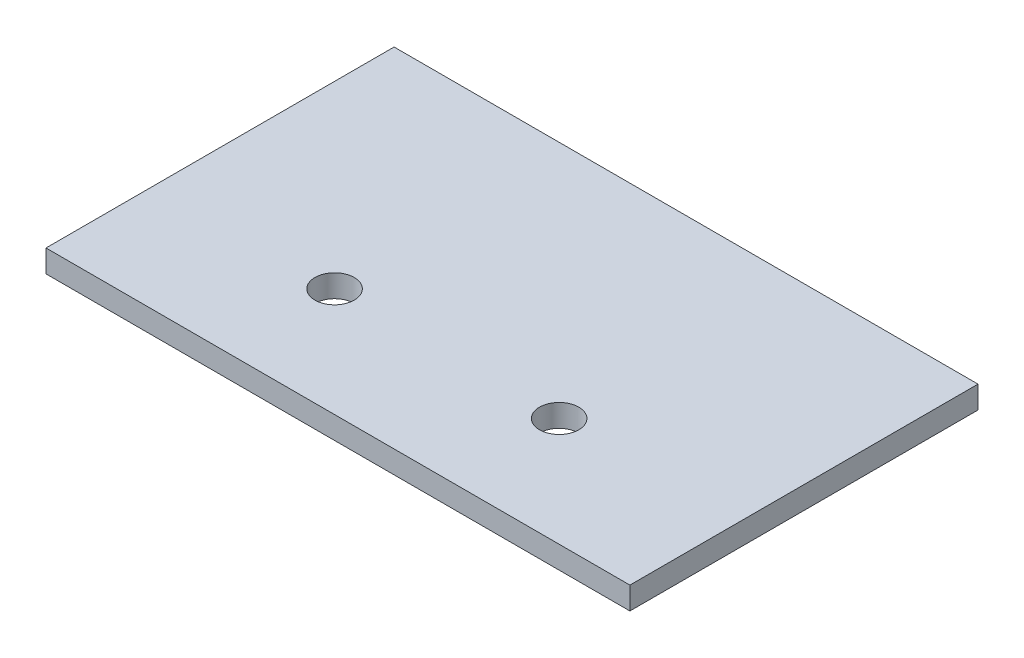
ISO-10303-21;
HEADER;
FILE_DESCRIPTION(('STEP AP214'),'2;1');
FILE_NAME('part.step','',(''),(''),'','','');
FILE_SCHEMA(('AUTOMOTIVE_DESIGN { 1 0 10303 214 1 1 1 1 }'));
ENDSEC;
DATA;
#1=APPLICATION_CONTEXT('core data for automotive mechanical design processes');
#2=APPLICATION_PROTOCOL_DEFINITION('international standard','automotive_design',2000,#1);
#3=PRODUCT_CONTEXT('',#1,'mechanical');
#4=PRODUCT('Part','Part','',(#3));
#5=PRODUCT_RELATED_PRODUCT_CATEGORY('part','',(#4));
#6=PRODUCT_DEFINITION_FORMATION('','',#4);
#7=PRODUCT_DEFINITION_CONTEXT('part definition',#1,'design');
#8=PRODUCT_DEFINITION('design','',#6,#7);
#9=PRODUCT_DEFINITION_SHAPE('','',#8);
#10=(LENGTH_UNIT() NAMED_UNIT(*) SI_UNIT(.MILLI.,.METRE.));
#11=(NAMED_UNIT(*) PLANE_ANGLE_UNIT() SI_UNIT($,.RADIAN.));
#12=(NAMED_UNIT(*) SI_UNIT($,.STERADIAN.) SOLID_ANGLE_UNIT());
#13=UNCERTAINTY_MEASURE_WITH_UNIT(LENGTH_MEASURE(1.E-05),#10,'distance_accuracy_value','');
#14=(GEOMETRIC_REPRESENTATION_CONTEXT(3) GLOBAL_UNCERTAINTY_ASSIGNED_CONTEXT((#13)) GLOBAL_UNIT_ASSIGNED_CONTEXT((#10,
#11,#12)) REPRESENTATION_CONTEXT('',''));
#15=CARTESIAN_POINT('',(0.,0.,0.));
#16=DIRECTION('',(0.,0.,1.));
#17=DIRECTION('',(1.,0.,0.));
#18=AXIS2_PLACEMENT_3D('',#15,#16,#17);
#19=CARTESIAN_POINT('',(0.,2.,0.));
#20=DIRECTION('',(0.,1.,0.));
#21=DIRECTION('',(0.,0.,1.));
#22=AXIS2_PLACEMENT_3D('',#19,#20,#21);
#23=PLANE('',#22);
#24=CARTESIAN_POINT('',(-10.,2.,5.8));
#25=DIRECTION('',(0.,1.,0.));
#26=DIRECTION('',(0.,0.,1.));
#27=AXIS2_PLACEMENT_3D('',#24,#25,#26);
#28=CIRCLE('',#27,1.75);
#29=CARTESIAN_POINT('',(-10.,2.,7.55));
#30=VERTEX_POINT('',#29);
#31=EDGE_CURVE('E100',#30,#30,#28,.T.);
#32=ORIENTED_EDGE('',*,*,#31,.F.);
#33=EDGE_LOOP('',(#32));
#34=FACE_BOUND('',#33,.T.);
#35=DIRECTION('',(0.,0.,-1.));
#36=VECTOR('',#35,1.);
#37=CARTESIAN_POINT('',(26.,2.,-15.5));
#38=LINE('',#37,#36);
#39=CARTESIAN_POINT('',(26.,2.,15.5));
#40=VERTEX_POINT('',#39);
#41=CARTESIAN_POINT('',(26.,2.,-15.5));
#42=VERTEX_POINT('',#41);
#43=EDGE_CURVE('E85',#40,#42,#38,.T.);
#44=ORIENTED_EDGE('',*,*,#43,.T.);
#45=DIRECTION('',(-1.,0.,0.));
#46=VECTOR('',#45,1.);
#47=CARTESIAN_POINT('',(-26.,2.,-15.5));
#48=LINE('',#47,#46);
#49=CARTESIAN_POINT('',(-26.,2.,-15.5));
#50=VERTEX_POINT('',#49);
#51=EDGE_CURVE('E80',#42,#50,#48,.T.);
#52=ORIENTED_EDGE('',*,*,#51,.T.);
#53=DIRECTION('',(0.,0.,1.));
#54=VECTOR('',#53,1.);
#55=CARTESIAN_POINT('',(-26.,2.,-15.5));
#56=LINE('',#55,#54);
#57=CARTESIAN_POINT('',(-26.,2.,15.5));
#58=VERTEX_POINT('',#57);
#59=EDGE_CURVE('E83',#50,#58,#56,.T.);
#60=ORIENTED_EDGE('',*,*,#59,.T.);
#61=DIRECTION('',(1.,0.,0.));
#62=VECTOR('',#61,1.);
#63=CARTESIAN_POINT('',(-26.,2.,15.5));
#64=LINE('',#63,#62);
#65=EDGE_CURVE('E50',#58,#40,#64,.T.);
#66=ORIENTED_EDGE('',*,*,#65,.T.);
#67=EDGE_LOOP('',(#44,#52,#60,#66));
#68=FACE_BOUND('',#67,.T.);
#69=CARTESIAN_POINT('',(10.,2.,5.8));
#70=DIRECTION('',(0.,1.,0.));
#71=DIRECTION('',(0.,0.,1.));
#72=AXIS2_PLACEMENT_3D('',#69,#70,#71);
#73=CIRCLE('',#72,1.75);
#74=CARTESIAN_POINT('',(10.,2.,7.55));
#75=VERTEX_POINT('',#74);
#76=EDGE_CURVE('E115',#75,#75,#73,.T.);
#77=ORIENTED_EDGE('',*,*,#76,.F.);
#78=EDGE_LOOP('',(#77));
#79=FACE_BOUND('',#78,.T.);
#80=ADVANCED_FACE('F33',(#34,#68,#79),#23,.T.);
#81=CARTESIAN_POINT('',(0.,0.,0.));
#82=DIRECTION('',(0.,1.,0.));
#83=DIRECTION('',(0.,0.,1.));
#84=AXIS2_PLACEMENT_3D('',#81,#82,#83);
#85=PLANE('',#84);
#86=DIRECTION('',(0.,0.,-1.));
#87=VECTOR('',#86,1.);
#88=CARTESIAN_POINT('',(26.,0.,-15.5));
#89=LINE('',#88,#87);
#90=CARTESIAN_POINT('',(26.,0.,15.5));
#91=VERTEX_POINT('',#90);
#92=CARTESIAN_POINT('',(26.,0.,-15.5));
#93=VERTEX_POINT('',#92);
#94=EDGE_CURVE('E97',#91,#93,#89,.T.);
#95=ORIENTED_EDGE('',*,*,#94,.F.);
#96=DIRECTION('',(1.,0.,0.));
#97=VECTOR('',#96,1.);
#98=CARTESIAN_POINT('',(-26.,0.,15.5));
#99=LINE('',#98,#97);
#100=CARTESIAN_POINT('',(-26.,0.,15.5));
#101=VERTEX_POINT('',#100);
#102=EDGE_CURVE('E73',#101,#91,#99,.T.);
#103=ORIENTED_EDGE('',*,*,#102,.F.);
#104=DIRECTION('',(0.,0.,1.));
#105=VECTOR('',#104,1.);
#106=CARTESIAN_POINT('',(-26.,0.,-15.5));
#107=LINE('',#106,#105);
#108=CARTESIAN_POINT('',(-26.,0.,-15.5));
#109=VERTEX_POINT('',#108);
#110=EDGE_CURVE('E67',#109,#101,#107,.T.);
#111=ORIENTED_EDGE('',*,*,#110,.F.);
#112=DIRECTION('',(-1.,0.,0.));
#113=VECTOR('',#112,1.);
#114=CARTESIAN_POINT('',(-26.,0.,-15.5));
#115=LINE('',#114,#113);
#116=EDGE_CURVE('E89',#93,#109,#115,.T.);
#117=ORIENTED_EDGE('',*,*,#116,.F.);
#118=EDGE_LOOP('',(#95,#103,#111,#117));
#119=FACE_BOUND('',#118,.T.);
#120=CARTESIAN_POINT('',(-10.,0.,5.8));
#121=DIRECTION('',(0.,1.,0.));
#122=DIRECTION('',(0.,0.,1.));
#123=AXIS2_PLACEMENT_3D('',#120,#121,#122);
#124=CIRCLE('',#123,1.75);
#125=CARTESIAN_POINT('',(-10.,0.,7.55));
#126=VERTEX_POINT('',#125);
#127=EDGE_CURVE('E112',#126,#126,#124,.T.);
#128=ORIENTED_EDGE('',*,*,#127,.T.);
#129=EDGE_LOOP('',(#128));
#130=FACE_BOUND('',#129,.T.);
#131=CARTESIAN_POINT('',(10.,0.,5.8));
#132=DIRECTION('',(0.,1.,0.));
#133=DIRECTION('',(0.,0.,1.));
#134=AXIS2_PLACEMENT_3D('',#131,#132,#133);
#135=CIRCLE('',#134,1.75);
#136=CARTESIAN_POINT('',(10.,0.,7.55));
#137=VERTEX_POINT('',#136);
#138=EDGE_CURVE('E118',#137,#137,#135,.T.);
#139=ORIENTED_EDGE('',*,*,#138,.T.);
#140=EDGE_LOOP('',(#139));
#141=FACE_BOUND('',#140,.T.);
#142=ADVANCED_FACE('F108',(#119,#130,#141),#85,.F.);
#143=CARTESIAN_POINT('',(26.,2.,-15.5));
#144=DIRECTION('',(-1.,0.,0.));
#145=DIRECTION('',(0.,0.,1.));
#146=AXIS2_PLACEMENT_3D('',#143,#144,#145);
#147=PLANE('',#146);
#148=ORIENTED_EDGE('',*,*,#94,.T.);
#149=DIRECTION('',(0.,-1.,0.));
#150=VECTOR('',#149,1.);
#151=CARTESIAN_POINT('',(26.,2.,-15.5));
#152=LINE('',#151,#150);
#153=EDGE_CURVE('E11',#42,#93,#152,.T.);
#154=ORIENTED_EDGE('',*,*,#153,.F.);
#155=ORIENTED_EDGE('',*,*,#43,.F.);
#156=DIRECTION('',(0.,-1.,0.));
#157=VECTOR('',#156,1.);
#158=CARTESIAN_POINT('',(26.,2.,15.5));
#159=LINE('',#158,#157);
#160=EDGE_CURVE('E93',#40,#91,#159,.T.);
#161=ORIENTED_EDGE('',*,*,#160,.T.);
#162=EDGE_LOOP('',(#148,#154,#155,#161));
#163=FACE_BOUND('',#162,.T.);
#164=ADVANCED_FACE('F35',(#163),#147,.F.);
#165=CARTESIAN_POINT('',(-26.,2.,-15.5));
#166=DIRECTION('',(0.,0.,1.));
#167=DIRECTION('',(1.,0.,0.));
#168=AXIS2_PLACEMENT_3D('',#165,#166,#167);
#169=PLANE('',#168);
#170=ORIENTED_EDGE('',*,*,#116,.T.);
#171=DIRECTION('',(0.,-1.,0.));
#172=VECTOR('',#171,1.);
#173=CARTESIAN_POINT('',(-26.,2.,-15.5));
#174=LINE('',#173,#172);
#175=EDGE_CURVE('E42',#50,#109,#174,.T.);
#176=ORIENTED_EDGE('',*,*,#175,.F.);
#177=ORIENTED_EDGE('',*,*,#51,.F.);
#178=ORIENTED_EDGE('',*,*,#153,.T.);
#179=EDGE_LOOP('',(#170,#176,#177,#178));
#180=FACE_BOUND('',#179,.T.);
#181=ADVANCED_FACE('F88',(#180),#169,.F.);
#182=CARTESIAN_POINT('',(-26.,2.,-15.5));
#183=DIRECTION('',(1.,0.,0.));
#184=DIRECTION('',(0.,0.,-1.));
#185=AXIS2_PLACEMENT_3D('',#182,#183,#184);
#186=PLANE('',#185);
#187=ORIENTED_EDGE('',*,*,#110,.T.);
#188=DIRECTION('',(0.,-1.,0.));
#189=VECTOR('',#188,1.);
#190=CARTESIAN_POINT('',(-26.,2.,15.5));
#191=LINE('',#190,#189);
#192=EDGE_CURVE('E90',#58,#101,#191,.T.);
#193=ORIENTED_EDGE('',*,*,#192,.F.);
#194=ORIENTED_EDGE('',*,*,#59,.F.);
#195=ORIENTED_EDGE('',*,*,#175,.T.);
#196=EDGE_LOOP('',(#187,#193,#194,#195));
#197=FACE_BOUND('',#196,.T.);
#198=ADVANCED_FACE('F91',(#197),#186,.F.);
#199=CARTESIAN_POINT('',(-26.,2.,15.5));
#200=DIRECTION('',(0.,0.,-1.));
#201=DIRECTION('',(-1.,0.,0.));
#202=AXIS2_PLACEMENT_3D('',#199,#200,#201);
#203=PLANE('',#202);
#204=ORIENTED_EDGE('',*,*,#102,.T.);
#205=ORIENTED_EDGE('',*,*,#160,.F.);
#206=ORIENTED_EDGE('',*,*,#65,.F.);
#207=ORIENTED_EDGE('',*,*,#192,.T.);
#208=EDGE_LOOP('',(#204,#205,#206,#207));
#209=FACE_BOUND('',#208,.T.);
#210=ADVANCED_FACE('F105',(#209),#203,.F.);
#211=CARTESIAN_POINT('',(-10.,2.,5.8));
#212=DIRECTION('',(0.,-1.,0.));
#213=DIRECTION('',(0.,0.,-1.));
#214=AXIS2_PLACEMENT_3D('',#211,#212,#213);
#215=CYLINDRICAL_SURFACE('',#214,1.75);
#216=ORIENTED_EDGE('',*,*,#31,.T.);
#217=EDGE_LOOP('',(#216));
#218=FACE_BOUND('',#217,.T.);
#219=ORIENTED_EDGE('',*,*,#127,.F.);
#220=EDGE_LOOP('',(#219));
#221=FACE_BOUND('',#220,.T.);
#222=ADVANCED_FACE('F135',(#218,#221),#215,.F.);
#223=CARTESIAN_POINT('',(10.,2.,5.8));
#224=DIRECTION('',(0.,-1.,0.));
#225=DIRECTION('',(0.,0.,-1.));
#226=AXIS2_PLACEMENT_3D('',#223,#224,#225);
#227=CYLINDRICAL_SURFACE('',#226,1.75);
#228=ORIENTED_EDGE('',*,*,#76,.T.);
#229=EDGE_LOOP('',(#228));
#230=FACE_BOUND('',#229,.T.);
#231=ORIENTED_EDGE('',*,*,#138,.F.);
#232=EDGE_LOOP('',(#231));
#233=FACE_BOUND('',#232,.T.);
#234=ADVANCED_FACE('F124',(#230,#233),#227,.F.);
#235=CLOSED_SHELL('',(#80,#142,#164,#181,#198,#210,#222,#234));
#236=MANIFOLD_SOLID_BREP('B2',#235);
#237=ADVANCED_BREP_SHAPE_REPRESENTATION('',(#18,#236),#14);
#238=SHAPE_DEFINITION_REPRESENTATION(#9,#237);
ENDSEC;
END-ISO-10303-21;
